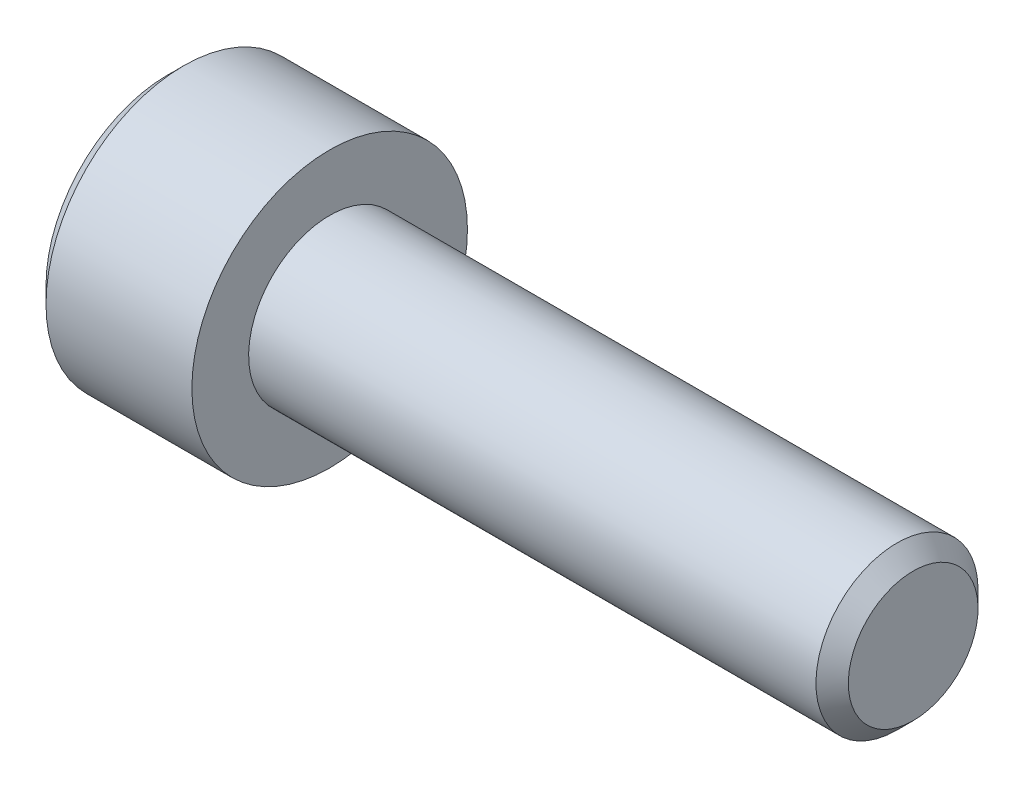
ISO-10303-21;
HEADER;
FILE_DESCRIPTION(('STEP AP214'),'2;1');
FILE_NAME('part.step','',(''),(''),'','','');
FILE_SCHEMA(('AUTOMOTIVE_DESIGN { 1 0 10303 214 1 1 1 1 }'));
ENDSEC;
DATA;
#1=APPLICATION_CONTEXT('core data for automotive mechanical design processes');
#2=APPLICATION_PROTOCOL_DEFINITION('international standard','automotive_design',2000,#1);
#3=PRODUCT_CONTEXT('',#1,'mechanical');
#4=PRODUCT('Part','Part','',(#3));
#5=PRODUCT_RELATED_PRODUCT_CATEGORY('part','',(#4));
#6=PRODUCT_DEFINITION_FORMATION('','',#4);
#7=PRODUCT_DEFINITION_CONTEXT('part definition',#1,'design');
#8=PRODUCT_DEFINITION('design','',#6,#7);
#9=PRODUCT_DEFINITION_SHAPE('','',#8);
#10=(LENGTH_UNIT() NAMED_UNIT(*) SI_UNIT(.MILLI.,.METRE.));
#11=(NAMED_UNIT(*) PLANE_ANGLE_UNIT() SI_UNIT($,.RADIAN.));
#12=(NAMED_UNIT(*) SI_UNIT($,.STERADIAN.) SOLID_ANGLE_UNIT());
#13=UNCERTAINTY_MEASURE_WITH_UNIT(LENGTH_MEASURE(1.E-05),#10,'distance_accuracy_value','');
#14=(GEOMETRIC_REPRESENTATION_CONTEXT(3) GLOBAL_UNCERTAINTY_ASSIGNED_CONTEXT((#13)) GLOBAL_UNIT_ASSIGNED_CONTEXT((#10,
#11,#12)) REPRESENTATION_CONTEXT('',''));
#15=CARTESIAN_POINT('',(0.,0.,0.));
#16=DIRECTION('',(0.,0.,1.));
#17=DIRECTION('',(1.,0.,0.));
#18=AXIS2_PLACEMENT_3D('',#15,#16,#17);
#19=CARTESIAN_POINT('',(-5.,0.,0.));
#20=DIRECTION('',(1.,0.,0.));
#21=DIRECTION('',(0.,1.,0.));
#22=AXIS2_PLACEMENT_3D('',#19,#20,#21);
#23=PLANE('',#22);
#24=CARTESIAN_POINT('',(-5.,0.,0.));
#25=DIRECTION('',(-1.,0.,0.));
#26=DIRECTION('',(0.,-1.,0.));
#27=AXIS2_PLACEMENT_3D('',#24,#25,#26);
#28=CIRCLE('',#27,3.75);
#29=CARTESIAN_POINT('',(-5.,-3.75,0.));
#30=VERTEX_POINT('',#29);
#31=EDGE_CURVE('E151',#30,#30,#28,.T.);
#32=ORIENTED_EDGE('',*,*,#31,.T.);
#33=EDGE_LOOP('',(#32));
#34=FACE_BOUND('',#33,.T.);
#35=DIRECTION('',(0.,-0.499999999999983,-0.866025403784448));
#36=VECTOR('',#35,1.);
#37=CARTESIAN_POINT('',(-5.,-1.1547005383793,2.));
#38=LINE('',#37,#36);
#39=CARTESIAN_POINT('',(-5.,-1.1547005383793,2.));
#40=VERTEX_POINT('',#39);
#41=CARTESIAN_POINT('',(-5.,-2.3094010767585,0.));
#42=VERTEX_POINT('',#41);
#43=EDGE_CURVE('E267',#40,#42,#38,.T.);
#44=ORIENTED_EDGE('',*,*,#43,.T.);
#45=DIRECTION('',(0.,0.499999999999983,-0.866025403784448));
#46=VECTOR('',#45,1.);
#47=CARTESIAN_POINT('',(-5.,-2.3094010767585,0.));
#48=LINE('',#47,#46);
#49=CARTESIAN_POINT('',(-5.,-1.1547005383793,-2.));
#50=VERTEX_POINT('',#49);
#51=EDGE_CURVE('E269',#42,#50,#48,.T.);
#52=ORIENTED_EDGE('',*,*,#51,.T.);
#53=DIRECTION('',(0.,1.,0.));
#54=VECTOR('',#53,1.);
#55=CARTESIAN_POINT('',(-5.,-1.1547005383793,-2.));
#56=LINE('',#55,#54);
#57=CARTESIAN_POINT('',(-5.,1.1547005383793,-2.));
#58=VERTEX_POINT('',#57);
#59=EDGE_CURVE('E271',#50,#58,#56,.T.);
#60=ORIENTED_EDGE('',*,*,#59,.T.);
#61=DIRECTION('',(0.,0.499999999999983,0.866025403784448));
#62=VECTOR('',#61,1.);
#63=CARTESIAN_POINT('',(-5.,1.1547005383793,-2.));
#64=LINE('',#63,#62);
#65=CARTESIAN_POINT('',(-5.,2.3094010767585,0.));
#66=VERTEX_POINT('',#65);
#67=EDGE_CURVE('E116',#58,#66,#64,.T.);
#68=ORIENTED_EDGE('',*,*,#67,.T.);
#69=DIRECTION('',(0.,-0.499999999999983,0.866025403784448));
#70=VECTOR('',#69,1.);
#71=CARTESIAN_POINT('',(-5.,2.3094010767585,0.));
#72=LINE('',#71,#70);
#73=CARTESIAN_POINT('',(-5.,1.1547005383793,2.));
#74=VERTEX_POINT('',#73);
#75=EDGE_CURVE('E264',#66,#74,#72,.T.);
#76=ORIENTED_EDGE('',*,*,#75,.T.);
#77=DIRECTION('',(0.,-1.,0.));
#78=VECTOR('',#77,1.);
#79=CARTESIAN_POINT('',(-5.,1.1547005383793,2.));
#80=LINE('',#79,#78);
#81=EDGE_CURVE('E131',#74,#40,#80,.T.);
#82=ORIENTED_EDGE('',*,*,#81,.T.);
#83=EDGE_LOOP('',(#44,#52,#60,#68,#76,#82));
#84=FACE_BOUND('',#83,.T.);
#85=ADVANCED_FACE('F32',(#34,#84),#23,.F.);
#86=CARTESIAN_POINT('',(-4.5,0.,0.));
#87=DIRECTION('',(1.,0.,0.));
#88=DIRECTION('',(0.,1.,0.));
#89=AXIS2_PLACEMENT_3D('',#86,#87,#88);
#90=CONICAL_SURFACE('',#89,4.25,0.785398163397448);
#91=ORIENTED_EDGE('',*,*,#31,.F.);
#92=EDGE_LOOP('',(#91));
#93=FACE_BOUND('',#92,.T.);
#94=CARTESIAN_POINT('',(-4.5,0.,0.));
#95=DIRECTION('',(-1.,0.,0.));
#96=DIRECTION('',(0.,-1.,0.));
#97=AXIS2_PLACEMENT_3D('',#94,#95,#96);
#98=CIRCLE('',#97,4.25);
#99=CARTESIAN_POINT('',(-4.5,-4.25,0.));
#100=VERTEX_POINT('',#99);
#101=EDGE_CURVE('E148',#100,#100,#98,.T.);
#102=ORIENTED_EDGE('',*,*,#101,.T.);
#103=EDGE_LOOP('',(#102));
#104=FACE_BOUND('',#103,.T.);
#105=ADVANCED_FACE('F171',(#93,#104),#90,.T.);
#106=CARTESIAN_POINT('',(18.,0.,0.));
#107=DIRECTION('',(-1.,0.,0.));
#108=DIRECTION('',(0.,-1.,0.));
#109=AXIS2_PLACEMENT_3D('',#106,#107,#108);
#110=CYLINDRICAL_SURFACE('',#109,4.25);
#111=ORIENTED_EDGE('',*,*,#101,.F.);
#112=EDGE_LOOP('',(#111));
#113=FACE_BOUND('',#112,.T.);
#114=CARTESIAN_POINT('',(0.,0.,0.));
#115=DIRECTION('',(-1.,0.,0.));
#116=DIRECTION('',(0.,-1.,0.));
#117=AXIS2_PLACEMENT_3D('',#114,#115,#116);
#118=CIRCLE('',#117,4.25);
#119=CARTESIAN_POINT('',(0.,-4.25,0.));
#120=VERTEX_POINT('',#119);
#121=EDGE_CURVE('E145',#120,#120,#118,.T.);
#122=ORIENTED_EDGE('',*,*,#121,.T.);
#123=EDGE_LOOP('',(#122));
#124=FACE_BOUND('',#123,.T.);
#125=ADVANCED_FACE('F176',(#113,#124),#110,.T.);
#126=CARTESIAN_POINT('',(0.,4.25,0.));
#127=DIRECTION('',(-1.,0.,0.));
#128=DIRECTION('',(0.,-1.,0.));
#129=AXIS2_PLACEMENT_3D('',#126,#127,#128);
#130=PLANE('',#129);
#131=ORIENTED_EDGE('',*,*,#121,.F.);
#132=EDGE_LOOP('',(#131));
#133=FACE_BOUND('',#132,.T.);
#134=CARTESIAN_POINT('',(0.,0.,0.));
#135=DIRECTION('',(-1.,0.,0.));
#136=DIRECTION('',(0.,-1.,0.));
#137=AXIS2_PLACEMENT_3D('',#134,#135,#136);
#138=CIRCLE('',#137,2.5);
#139=CARTESIAN_POINT('',(0.,-2.5,0.));
#140=VERTEX_POINT('',#139);
#141=EDGE_CURVE('E141',#140,#140,#138,.T.);
#142=ORIENTED_EDGE('',*,*,#141,.T.);
#143=EDGE_LOOP('',(#142));
#144=FACE_BOUND('',#143,.T.);
#145=ADVANCED_FACE('F183',(#133,#144),#130,.F.);
#146=CARTESIAN_POINT('',(18.,0.,0.));
#147=DIRECTION('',(-1.,0.,0.));
#148=DIRECTION('',(0.,-1.,0.));
#149=AXIS2_PLACEMENT_3D('',#146,#147,#148);
#150=CYLINDRICAL_SURFACE('',#149,2.5);
#151=CARTESIAN_POINT('',(17.5,0.,0.));
#152=DIRECTION('',(-1.,0.,0.));
#153=DIRECTION('',(0.,-1.,0.));
#154=AXIS2_PLACEMENT_3D('',#151,#152,#153);
#155=CIRCLE('',#154,2.5);
#156=CARTESIAN_POINT('',(17.5,-2.5,0.));
#157=VERTEX_POINT('',#156);
#158=EDGE_CURVE('E40',#157,#157,#155,.T.);
#159=ORIENTED_EDGE('',*,*,#158,.T.);
#160=EDGE_LOOP('',(#159));
#161=FACE_BOUND('',#160,.T.);
#162=ORIENTED_EDGE('',*,*,#141,.F.);
#163=EDGE_LOOP('',(#162));
#164=FACE_BOUND('',#163,.T.);
#165=ADVANCED_FACE('F156',(#161,#164),#150,.T.);
#166=CARTESIAN_POINT('',(18.,2.5,0.));
#167=DIRECTION('',(-1.,0.,0.));
#168=DIRECTION('',(0.,-1.,0.));
#169=AXIS2_PLACEMENT_3D('',#166,#167,#168);
#170=PLANE('',#169);
#171=CARTESIAN_POINT('',(18.,0.,0.));
#172=DIRECTION('',(-1.,0.,0.));
#173=DIRECTION('',(0.,-1.,0.));
#174=AXIS2_PLACEMENT_3D('',#171,#172,#173);
#175=CIRCLE('',#174,2.);
#176=CARTESIAN_POINT('',(18.,-2.,0.));
#177=VERTEX_POINT('',#176);
#178=EDGE_CURVE('E11',#177,#177,#175,.F.);
#179=ORIENTED_EDGE('',*,*,#178,.T.);
#180=EDGE_LOOP('',(#179));
#181=FACE_BOUND('',#180,.T.);
#182=ADVANCED_FACE('F160',(#181),#170,.F.);
#183=CARTESIAN_POINT('',(17.5,0.,0.));
#184=DIRECTION('',(-1.,0.,0.));
#185=DIRECTION('',(0.,-1.,0.));
#186=AXIS2_PLACEMENT_3D('',#183,#184,#185);
#187=CONICAL_SURFACE('',#186,2.5,0.785398163397445);
#188=ORIENTED_EDGE('',*,*,#178,.F.);
#189=EDGE_LOOP('',(#188));
#190=FACE_BOUND('',#189,.T.);
#191=ORIENTED_EDGE('',*,*,#158,.F.);
#192=EDGE_LOOP('',(#191));
#193=FACE_BOUND('',#192,.T.);
#194=ADVANCED_FACE('F34',(#190,#193),#187,.T.);
#195=CARTESIAN_POINT('',(-2.5,2.3094010767585,0.));
#196=DIRECTION('',(0.,-0.866025403784448,-0.499999999999983));
#197=DIRECTION('',(0.,0.499999999999983,-0.866025403784448));
#198=AXIS2_PLACEMENT_3D('',#195,#196,#197);
#199=PLANE('',#198);
#200=DIRECTION('',(0.,-0.499999999999983,0.866025403784448));
#201=VECTOR('',#200,1.);
#202=CARTESIAN_POINT('',(-2.5,2.3094010767585,0.));
#203=LINE('',#202,#201);
#204=CARTESIAN_POINT('',(-2.5,2.3094010767585,0.));
#205=VERTEX_POINT('',#204);
#206=CARTESIAN_POINT('',(-2.5,1.73205080756891,0.999999999999976));
#207=VERTEX_POINT('',#206);
#208=EDGE_CURVE('E113',#205,#207,#203,.T.);
#209=ORIENTED_EDGE('',*,*,#208,.T.);
#210=CARTESIAN_POINT('',(-2.5,1.1547005383793,2.));
#211=VERTEX_POINT('',#210);
#212=EDGE_CURVE('E105',#207,#211,#203,.T.);
#213=ORIENTED_EDGE('',*,*,#212,.T.);
#214=DIRECTION('',(-1.,0.,0.));
#215=VECTOR('',#214,1.);
#216=CARTESIAN_POINT('',(-2.5,1.1547005383793,2.));
#217=LINE('',#216,#215);
#218=EDGE_CURVE('E110',#211,#74,#217,.T.);
#219=ORIENTED_EDGE('',*,*,#218,.T.);
#220=ORIENTED_EDGE('',*,*,#75,.F.);
#221=DIRECTION('',(-1.,0.,0.));
#222=VECTOR('',#221,1.);
#223=CARTESIAN_POINT('',(-2.5,2.3094010767585,0.));
#224=LINE('',#223,#222);
#225=EDGE_CURVE('E248',#205,#66,#224,.T.);
#226=ORIENTED_EDGE('',*,*,#225,.F.);
#227=EDGE_LOOP('',(#209,#213,#219,#220,#226));
#228=FACE_BOUND('',#227,.T.);
#229=ADVANCED_FACE('F107',(#228),#199,.T.);
#230=CARTESIAN_POINT('',(-2.5,1.1547005383793,2.));
#231=DIRECTION('',(0.,0.,-1.));
#232=DIRECTION('',(-1.,0.,0.));
#233=AXIS2_PLACEMENT_3D('',#230,#231,#232);
#234=PLANE('',#233);
#235=DIRECTION('',(0.,-1.,0.));
#236=VECTOR('',#235,1.);
#237=CARTESIAN_POINT('',(-2.5,1.1547005383793,2.));
#238=LINE('',#237,#236);
#239=CARTESIAN_POINT('',(-2.5,0.,2.));
#240=VERTEX_POINT('',#239);
#241=EDGE_CURVE('E119',#211,#240,#238,.T.);
#242=ORIENTED_EDGE('',*,*,#241,.T.);
#243=CARTESIAN_POINT('',(-2.5,-1.1547005383793,2.));
#244=VERTEX_POINT('',#243);
#245=EDGE_CURVE('E126',#240,#244,#238,.T.);
#246=ORIENTED_EDGE('',*,*,#245,.T.);
#247=DIRECTION('',(-1.,0.,0.));
#248=VECTOR('',#247,1.);
#249=CARTESIAN_POINT('',(-2.5,-1.1547005383793,2.));
#250=LINE('',#249,#248);
#251=EDGE_CURVE('E133',#244,#40,#250,.T.);
#252=ORIENTED_EDGE('',*,*,#251,.T.);
#253=ORIENTED_EDGE('',*,*,#81,.F.);
#254=ORIENTED_EDGE('',*,*,#218,.F.);
#255=EDGE_LOOP('',(#242,#246,#252,#253,#254));
#256=FACE_BOUND('',#255,.T.);
#257=ADVANCED_FACE('F129',(#256),#234,.T.);
#258=CARTESIAN_POINT('',(-2.5,-1.1547005383793,2.));
#259=DIRECTION('',(0.,0.866025403784448,-0.499999999999983));
#260=DIRECTION('',(0.,0.499999999999983,0.866025403784448));
#261=AXIS2_PLACEMENT_3D('',#258,#259,#260);
#262=PLANE('',#261);
#263=DIRECTION('',(0.,-0.499999999999983,-0.866025403784448));
#264=VECTOR('',#263,1.);
#265=CARTESIAN_POINT('',(-2.5,-1.1547005383793,2.));
#266=LINE('',#265,#264);
#267=CARTESIAN_POINT('',(-2.5,-1.73205080756891,0.999999999999976));
#268=VERTEX_POINT('',#267);
#269=EDGE_CURVE('E255',#244,#268,#266,.T.);
#270=ORIENTED_EDGE('',*,*,#269,.T.);
#271=CARTESIAN_POINT('',(-2.5,-2.3094010767585,0.));
#272=VERTEX_POINT('',#271);
#273=EDGE_CURVE('E125',#268,#272,#266,.T.);
#274=ORIENTED_EDGE('',*,*,#273,.T.);
#275=DIRECTION('',(-1.,0.,0.));
#276=VECTOR('',#275,1.);
#277=CARTESIAN_POINT('',(-2.5,-2.3094010767585,0.));
#278=LINE('',#277,#276);
#279=EDGE_CURVE('E137',#272,#42,#278,.T.);
#280=ORIENTED_EDGE('',*,*,#279,.T.);
#281=ORIENTED_EDGE('',*,*,#43,.F.);
#282=ORIENTED_EDGE('',*,*,#251,.F.);
#283=EDGE_LOOP('',(#270,#274,#280,#281,#282));
#284=FACE_BOUND('',#283,.T.);
#285=ADVANCED_FACE('F197',(#284),#262,.T.);
#286=CARTESIAN_POINT('',(-2.5,-2.3094010767585,0.));
#287=DIRECTION('',(0.,0.866025403784448,0.499999999999983));
#288=DIRECTION('',(0.,-0.499999999999983,0.866025403784448));
#289=AXIS2_PLACEMENT_3D('',#286,#287,#288);
#290=PLANE('',#289);
#291=DIRECTION('',(0.,0.499999999999983,-0.866025403784448));
#292=VECTOR('',#291,1.);
#293=CARTESIAN_POINT('',(-2.5,-2.3094010767585,0.));
#294=LINE('',#293,#292);
#295=CARTESIAN_POINT('',(-2.5,-1.7320508075689,-0.999999999999967));
#296=VERTEX_POINT('',#295);
#297=EDGE_CURVE('E47',#272,#296,#294,.T.);
#298=ORIENTED_EDGE('',*,*,#297,.T.);
#299=CARTESIAN_POINT('',(-2.5,-1.1547005383793,-2.));
#300=VERTEX_POINT('',#299);
#301=EDGE_CURVE('E260',#296,#300,#294,.T.);
#302=ORIENTED_EDGE('',*,*,#301,.T.);
#303=DIRECTION('',(-1.,0.,0.));
#304=VECTOR('',#303,1.);
#305=CARTESIAN_POINT('',(-2.5,-1.1547005383793,-2.));
#306=LINE('',#305,#304);
#307=EDGE_CURVE('E276',#300,#50,#306,.T.);
#308=ORIENTED_EDGE('',*,*,#307,.T.);
#309=ORIENTED_EDGE('',*,*,#51,.F.);
#310=ORIENTED_EDGE('',*,*,#279,.F.);
#311=EDGE_LOOP('',(#298,#302,#308,#309,#310));
#312=FACE_BOUND('',#311,.T.);
#313=ADVANCED_FACE('F200',(#312),#290,.T.);
#314=CARTESIAN_POINT('',(-2.5,-1.1547005383793,-2.));
#315=DIRECTION('',(0.,0.,1.));
#316=DIRECTION('',(1.,0.,0.));
#317=AXIS2_PLACEMENT_3D('',#314,#315,#316);
#318=PLANE('',#317);
#319=DIRECTION('',(0.,1.,0.));
#320=VECTOR('',#319,1.);
#321=CARTESIAN_POINT('',(-2.5,-1.1547005383793,-2.));
#322=LINE('',#321,#320);
#323=CARTESIAN_POINT('',(-2.5,0.,-2.));
#324=VERTEX_POINT('',#323);
#325=EDGE_CURVE('E242',#300,#324,#322,.T.);
#326=ORIENTED_EDGE('',*,*,#325,.T.);
#327=CARTESIAN_POINT('',(-2.5,1.1547005383793,-2.));
#328=VERTEX_POINT('',#327);
#329=EDGE_CURVE('E235',#324,#328,#322,.T.);
#330=ORIENTED_EDGE('',*,*,#329,.T.);
#331=DIRECTION('',(-1.,0.,0.));
#332=VECTOR('',#331,1.);
#333=CARTESIAN_POINT('',(-2.5,1.1547005383793,-2.));
#334=LINE('',#333,#332);
#335=EDGE_CURVE('E247',#328,#58,#334,.T.);
#336=ORIENTED_EDGE('',*,*,#335,.T.);
#337=ORIENTED_EDGE('',*,*,#59,.F.);
#338=ORIENTED_EDGE('',*,*,#307,.F.);
#339=EDGE_LOOP('',(#326,#330,#336,#337,#338));
#340=FACE_BOUND('',#339,.T.);
#341=ADVANCED_FACE('F204',(#340),#318,.T.);
#342=CARTESIAN_POINT('',(-2.5,1.1547005383793,-2.));
#343=DIRECTION('',(0.,-0.866025403784448,0.499999999999983));
#344=DIRECTION('',(0.,-0.499999999999983,-0.866025403784448));
#345=AXIS2_PLACEMENT_3D('',#342,#343,#344);
#346=PLANE('',#345);
#347=DIRECTION('',(0.,0.499999999999983,0.866025403784448));
#348=VECTOR('',#347,1.);
#349=CARTESIAN_POINT('',(-2.5,1.1547005383793,-2.));
#350=LINE('',#349,#348);
#351=CARTESIAN_POINT('',(-2.5,1.73205080756891,-0.999999999999976));
#352=VERTEX_POINT('',#351);
#353=EDGE_CURVE('E234',#328,#352,#350,.T.);
#354=ORIENTED_EDGE('',*,*,#353,.T.);
#355=EDGE_CURVE('E240',#352,#205,#350,.T.);
#356=ORIENTED_EDGE('',*,*,#355,.T.);
#357=ORIENTED_EDGE('',*,*,#225,.T.);
#358=ORIENTED_EDGE('',*,*,#67,.F.);
#359=ORIENTED_EDGE('',*,*,#335,.F.);
#360=EDGE_LOOP('',(#354,#356,#357,#358,#359));
#361=FACE_BOUND('',#360,.T.);
#362=ADVANCED_FACE('F207',(#361),#346,.T.);
#363=CARTESIAN_POINT('',(-2.5,1.1547005383793,2.));
#364=DIRECTION('',(1.,0.,0.));
#365=DIRECTION('',(0.,0.,-1.));
#366=AXIS2_PLACEMENT_3D('',#363,#364,#365);
#367=PLANE('',#366);
#368=CARTESIAN_POINT('',(-2.5,0.,0.));
#369=DIRECTION('',(-1.,0.,0.));
#370=DIRECTION('',(0.,0.,1.));
#371=AXIS2_PLACEMENT_3D('',#368,#369,#370);
#372=CIRCLE('',#371,2.);
#373=EDGE_CURVE('E231',#352,#324,#372,.T.);
#374=ORIENTED_EDGE('',*,*,#373,.F.);
#375=ORIENTED_EDGE('',*,*,#353,.F.);
#376=ORIENTED_EDGE('',*,*,#329,.F.);
#377=EDGE_LOOP('',(#374,#375,#376));
#378=FACE_BOUND('',#377,.T.);
#379=ADVANCED_FACE('F211',(#378),#367,.F.);
#380=EDGE_CURVE('E142',#207,#352,#372,.T.);
#381=ORIENTED_EDGE('',*,*,#380,.F.);
#382=ORIENTED_EDGE('',*,*,#208,.F.);
#383=ORIENTED_EDGE('',*,*,#355,.F.);
#384=EDGE_LOOP('',(#381,#382,#383));
#385=FACE_BOUND('',#384,.T.);
#386=ADVANCED_FACE('F222',(#385),#367,.F.);
#387=EDGE_CURVE('E121',#240,#207,#372,.T.);
#388=ORIENTED_EDGE('',*,*,#387,.F.);
#389=ORIENTED_EDGE('',*,*,#241,.F.);
#390=ORIENTED_EDGE('',*,*,#212,.F.);
#391=EDGE_LOOP('',(#388,#389,#390));
#392=FACE_BOUND('',#391,.T.);
#393=ADVANCED_FACE('F120',(#392),#367,.F.);
#394=EDGE_CURVE('E132',#268,#240,#372,.T.);
#395=ORIENTED_EDGE('',*,*,#394,.F.);
#396=ORIENTED_EDGE('',*,*,#269,.F.);
#397=ORIENTED_EDGE('',*,*,#245,.F.);
#398=EDGE_LOOP('',(#395,#396,#397));
#399=FACE_BOUND('',#398,.T.);
#400=ADVANCED_FACE('F219',(#399),#367,.F.);
#401=EDGE_CURVE('E135',#296,#268,#372,.T.);
#402=ORIENTED_EDGE('',*,*,#401,.F.);
#403=ORIENTED_EDGE('',*,*,#297,.F.);
#404=ORIENTED_EDGE('',*,*,#273,.F.);
#405=EDGE_LOOP('',(#402,#403,#404));
#406=FACE_BOUND('',#405,.T.);
#407=ADVANCED_FACE('F214',(#406),#367,.F.);
#408=EDGE_CURVE('E239',#324,#296,#372,.T.);
#409=ORIENTED_EDGE('',*,*,#408,.F.);
#410=ORIENTED_EDGE('',*,*,#325,.F.);
#411=ORIENTED_EDGE('',*,*,#301,.F.);
#412=EDGE_LOOP('',(#409,#410,#411));
#413=FACE_BOUND('',#412,.T.);
#414=ADVANCED_FACE('F192',(#413),#367,.F.);
#415=CARTESIAN_POINT('',(-1.9641016151378,0.,0.));
#416=DIRECTION('',(-1.,0.,0.));
#417=DIRECTION('',(0.,0.,1.));
#418=AXIS2_PLACEMENT_3D('',#415,#416,#417);
#419=CONICAL_SURFACE('',#418,0.,1.30899693899577);
#420=ORIENTED_EDGE('',*,*,#387,.T.);
#421=ORIENTED_EDGE('',*,*,#380,.T.);
#422=ORIENTED_EDGE('',*,*,#373,.T.);
#423=ORIENTED_EDGE('',*,*,#408,.T.);
#424=ORIENTED_EDGE('',*,*,#401,.T.);
#425=ORIENTED_EDGE('',*,*,#394,.T.);
#426=EDGE_LOOP('',(#420,#421,#422,#423,#424,#425));
#427=FACE_BOUND('',#426,.T.);
#428=CARTESIAN_POINT('',(-1.9641016151378,0.,0.));
#429=VERTEX_POINT('',#428);
#430=VERTEX_LOOP('',#429);
#431=FACE_BOUND('',#430,.T.);
#432=ADVANCED_FACE('F190',(#427,#431),#419,.F.);
#433=CLOSED_SHELL('',(#85,#105,#125,#145,#165,#182,#194,#229,#257,#285,#313,#341,#362,#379,#386,
#393,#400,#407,#414,#432));
#434=MANIFOLD_SOLID_BREP('B2',#433);
#435=ADVANCED_BREP_SHAPE_REPRESENTATION('',(#18,#434),#14);
#436=SHAPE_DEFINITION_REPRESENTATION(#9,#435);
ENDSEC;
END-ISO-10303-21;
